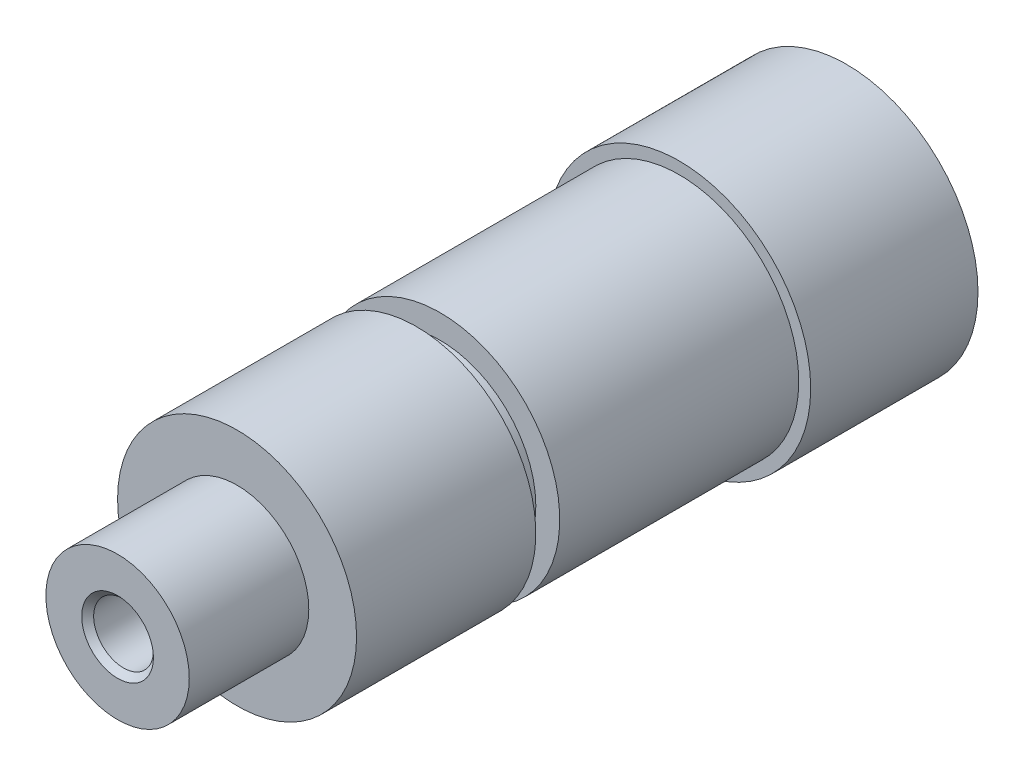
ISO-10303-21;
HEADER;
FILE_DESCRIPTION(('STEP AP214'),'2;1');
FILE_NAME('part.step','',(''),(''),'','','');
FILE_SCHEMA(('AUTOMOTIVE_DESIGN { 1 0 10303 214 1 1 1 1 }'));
ENDSEC;
DATA;
#1=APPLICATION_CONTEXT('core data for automotive mechanical design processes');
#2=APPLICATION_PROTOCOL_DEFINITION('international standard','automotive_design',2000,#1);
#3=PRODUCT_CONTEXT('',#1,'mechanical');
#4=PRODUCT('Part','Part','',(#3));
#5=PRODUCT_RELATED_PRODUCT_CATEGORY('part','',(#4));
#6=PRODUCT_DEFINITION_FORMATION('','',#4);
#7=PRODUCT_DEFINITION_CONTEXT('part definition',#1,'design');
#8=PRODUCT_DEFINITION('design','',#6,#7);
#9=PRODUCT_DEFINITION_SHAPE('','',#8);
#10=(LENGTH_UNIT() NAMED_UNIT(*) SI_UNIT(.MILLI.,.METRE.));
#11=(NAMED_UNIT(*) PLANE_ANGLE_UNIT() SI_UNIT($,.RADIAN.));
#12=(NAMED_UNIT(*) SI_UNIT($,.STERADIAN.) SOLID_ANGLE_UNIT());
#13=UNCERTAINTY_MEASURE_WITH_UNIT(LENGTH_MEASURE(1.E-05),#10,'distance_accuracy_value','');
#14=(GEOMETRIC_REPRESENTATION_CONTEXT(3) GLOBAL_UNCERTAINTY_ASSIGNED_CONTEXT((#13)) GLOBAL_UNIT_ASSIGNED_CONTEXT((#10,
#11,#12)) REPRESENTATION_CONTEXT('',''));
#15=CARTESIAN_POINT('',(0.,0.,0.));
#16=DIRECTION('',(0.,0.,1.));
#17=DIRECTION('',(1.,0.,0.));
#18=AXIS2_PLACEMENT_3D('',#15,#16,#17);
#19=CARTESIAN_POINT('',(0.,0.,51.));
#20=DIRECTION('',(0.,0.,1.));
#21=DIRECTION('',(1.,0.,0.));
#22=AXIS2_PLACEMENT_3D('',#19,#20,#21);
#23=PLANE('',#22);
#24=CARTESIAN_POINT('',(0.,0.,51.));
#25=DIRECTION('',(0.,0.,1.));
#26=DIRECTION('',(1.,0.,0.));
#27=AXIS2_PLACEMENT_3D('',#24,#25,#26);
#28=CIRCLE('',#27,10.);
#29=CARTESIAN_POINT('',(10.,0.,51.));
#30=VERTEX_POINT('',#29);
#31=EDGE_CURVE('E88',#30,#30,#28,.T.);
#32=ORIENTED_EDGE('',*,*,#31,.T.);
#33=EDGE_LOOP('',(#32));
#34=FACE_BOUND('',#33,.T.);
#35=CARTESIAN_POINT('',(0.,0.,51.));
#36=DIRECTION('',(0.,0.,1.));
#37=DIRECTION('',(1.,0.,0.));
#38=AXIS2_PLACEMENT_3D('',#35,#36,#37);
#39=CIRCLE('',#38,6.);
#40=CARTESIAN_POINT('',(6.,0.,51.));
#41=VERTEX_POINT('',#40);
#42=EDGE_CURVE('E67',#41,#41,#39,.T.);
#43=ORIENTED_EDGE('',*,*,#42,.F.);
#44=EDGE_LOOP('',(#43));
#45=FACE_BOUND('',#44,.T.);
#46=ADVANCED_FACE('F40',(#34,#45),#23,.T.);
#47=CARTESIAN_POINT('',(0.,0.,51.));
#48=DIRECTION('',(0.,0.,-1.));
#49=DIRECTION('',(-1.,0.,0.));
#50=AXIS2_PLACEMENT_3D('',#47,#48,#49);
#51=CYLINDRICAL_SURFACE('',#50,10.);
#52=CARTESIAN_POINT('',(0.,0.,14.));
#53=DIRECTION('',(0.,0.,1.));
#54=DIRECTION('',(1.,0.,0.));
#55=AXIS2_PLACEMENT_3D('',#52,#53,#54);
#56=CIRCLE('',#55,10.);
#57=CARTESIAN_POINT('',(10.,0.,14.));
#58=VERTEX_POINT('',#57);
#59=EDGE_CURVE('E85',#58,#58,#56,.T.);
#60=ORIENTED_EDGE('',*,*,#59,.T.);
#61=EDGE_LOOP('',(#60));
#62=FACE_BOUND('',#61,.T.);
#63=CARTESIAN_POINT('',(0.,0.,34.));
#64=DIRECTION('',(0.,0.,-1.));
#65=DIRECTION('',(-1.,0.,0.));
#66=AXIS2_PLACEMENT_3D('',#63,#64,#65);
#67=CIRCLE('',#66,10.);
#68=CARTESIAN_POINT('',(-10.,0.,34.));
#69=VERTEX_POINT('',#68);
#70=EDGE_CURVE('E82',#69,#69,#67,.T.);
#71=ORIENTED_EDGE('',*,*,#70,.T.);
#72=EDGE_LOOP('',(#71));
#73=FACE_BOUND('',#72,.T.);
#74=ADVANCED_FACE('F110',(#62,#73),#51,.T.);
#75=CARTESIAN_POINT('',(0.,0.,14.));
#76=DIRECTION('',(0.,0.,1.));
#77=DIRECTION('',(1.,0.,0.));
#78=AXIS2_PLACEMENT_3D('',#75,#76,#77);
#79=PLANE('',#78);
#80=CARTESIAN_POINT('',(0.,0.,14.));
#81=DIRECTION('',(0.,0.,1.));
#82=DIRECTION('',(1.,0.,0.));
#83=AXIS2_PLACEMENT_3D('',#80,#81,#82);
#84=CIRCLE('',#83,11.);
#85=CARTESIAN_POINT('',(11.,0.,14.));
#86=VERTEX_POINT('',#85);
#87=EDGE_CURVE('E11',#86,#86,#84,.T.);
#88=ORIENTED_EDGE('',*,*,#87,.T.);
#89=EDGE_LOOP('',(#88));
#90=FACE_BOUND('',#89,.T.);
#91=ORIENTED_EDGE('',*,*,#59,.F.);
#92=EDGE_LOOP('',(#91));
#93=FACE_BOUND('',#92,.T.);
#94=ADVANCED_FACE('F106',(#90,#93),#79,.T.);
#95=CARTESIAN_POINT('',(0.,0.,14.));
#96=DIRECTION('',(0.,0.,-1.));
#97=DIRECTION('',(-1.,0.,0.));
#98=AXIS2_PLACEMENT_3D('',#95,#96,#97);
#99=CYLINDRICAL_SURFACE('',#98,11.);
#100=ORIENTED_EDGE('',*,*,#87,.F.);
#101=EDGE_LOOP('',(#100));
#102=FACE_BOUND('',#101,.T.);
#103=CARTESIAN_POINT('',(0.,0.,0.));
#104=DIRECTION('',(0.,0.,1.));
#105=DIRECTION('',(1.,0.,0.));
#106=AXIS2_PLACEMENT_3D('',#103,#104,#105);
#107=CIRCLE('',#106,11.);
#108=CARTESIAN_POINT('',(11.,0.,0.));
#109=VERTEX_POINT('',#108);
#110=EDGE_CURVE('E47',#109,#109,#107,.T.);
#111=ORIENTED_EDGE('',*,*,#110,.T.);
#112=EDGE_LOOP('',(#111));
#113=FACE_BOUND('',#112,.T.);
#114=ADVANCED_FACE('F42',(#102,#113),#99,.T.);
#115=CARTESIAN_POINT('',(0.,0.,0.));
#116=DIRECTION('',(0.,0.,1.));
#117=DIRECTION('',(1.,0.,0.));
#118=AXIS2_PLACEMENT_3D('',#115,#116,#117);
#119=PLANE('',#118);
#120=ORIENTED_EDGE('',*,*,#110,.F.);
#121=EDGE_LOOP('',(#120));
#122=FACE_BOUND('',#121,.T.);
#123=ADVANCED_FACE('F95',(#122),#119,.F.);
#124=CARTESIAN_POINT('',(10.,0.,34.));
#125=DIRECTION('',(0.,0.,1.));
#126=DIRECTION('',(1.,0.,0.));
#127=AXIS2_PLACEMENT_3D('',#124,#125,#126);
#128=PLANE('',#127);
#129=CARTESIAN_POINT('',(0.,0.,34.));
#130=DIRECTION('',(0.,0.,-1.));
#131=DIRECTION('',(-1.,0.,0.));
#132=AXIS2_PLACEMENT_3D('',#129,#130,#131);
#133=CIRCLE('',#132,8.);
#134=CARTESIAN_POINT('',(-8.,0.,34.));
#135=VERTEX_POINT('',#134);
#136=EDGE_CURVE('E79',#135,#135,#133,.T.);
#137=ORIENTED_EDGE('',*,*,#136,.T.);
#138=EDGE_LOOP('',(#137));
#139=FACE_BOUND('',#138,.T.);
#140=ORIENTED_EDGE('',*,*,#70,.F.);
#141=EDGE_LOOP('',(#140));
#142=FACE_BOUND('',#141,.T.);
#143=ADVANCED_FACE('F97',(#139,#142),#128,.T.);
#144=CARTESIAN_POINT('',(0.,0.,0.));
#145=DIRECTION('',(0.,0.,-1.));
#146=DIRECTION('',(-1.,0.,0.));
#147=AXIS2_PLACEMENT_3D('',#144,#145,#146);
#148=CYLINDRICAL_SURFACE('',#147,8.);
#149=CARTESIAN_POINT('',(0.,0.,36.));
#150=DIRECTION('',(0.,0.,-1.));
#151=DIRECTION('',(-1.,0.,0.));
#152=AXIS2_PLACEMENT_3D('',#149,#150,#151);
#153=CIRCLE('',#152,8.);
#154=CARTESIAN_POINT('',(-8.,0.,36.));
#155=VERTEX_POINT('',#154);
#156=EDGE_CURVE('E76',#155,#155,#153,.T.);
#157=ORIENTED_EDGE('',*,*,#156,.T.);
#158=EDGE_LOOP('',(#157));
#159=FACE_BOUND('',#158,.T.);
#160=ORIENTED_EDGE('',*,*,#136,.F.);
#161=EDGE_LOOP('',(#160));
#162=FACE_BOUND('',#161,.T.);
#163=ADVANCED_FACE('F103',(#159,#162),#148,.T.);
#164=CARTESIAN_POINT('',(8.,0.,36.));
#165=DIRECTION('',(0.,0.,-1.));
#166=DIRECTION('',(-1.,0.,0.));
#167=AXIS2_PLACEMENT_3D('',#164,#165,#166);
#168=PLANE('',#167);
#169=CARTESIAN_POINT('',(0.,0.,36.));
#170=DIRECTION('',(0.,0.,-1.));
#171=DIRECTION('',(-1.,0.,0.));
#172=AXIS2_PLACEMENT_3D('',#169,#170,#171);
#173=CIRCLE('',#172,10.);
#174=CARTESIAN_POINT('',(-10.,0.,36.));
#175=VERTEX_POINT('',#174);
#176=EDGE_CURVE('E73',#175,#175,#173,.T.);
#177=ORIENTED_EDGE('',*,*,#176,.T.);
#178=EDGE_LOOP('',(#177));
#179=FACE_BOUND('',#178,.T.);
#180=ORIENTED_EDGE('',*,*,#156,.F.);
#181=EDGE_LOOP('',(#180));
#182=FACE_BOUND('',#181,.T.);
#183=ADVANCED_FACE('F122',(#179,#182),#168,.T.);
#184=ORIENTED_EDGE('',*,*,#31,.F.);
#185=EDGE_LOOP('',(#184));
#186=FACE_BOUND('',#185,.T.);
#187=ORIENTED_EDGE('',*,*,#176,.F.);
#188=EDGE_LOOP('',(#187));
#189=FACE_BOUND('',#188,.T.);
#190=ADVANCED_FACE('F117',(#186,#189),#51,.T.);
#191=CARTESIAN_POINT('',(0.,0.,61.));
#192=DIRECTION('',(0.,0.,-1.));
#193=DIRECTION('',(-1.,0.,0.));
#194=AXIS2_PLACEMENT_3D('',#191,#192,#193);
#195=CYLINDRICAL_SURFACE('',#194,6.);
#196=CARTESIAN_POINT('',(0.,0.,61.));
#197=DIRECTION('',(0.,0.,1.));
#198=DIRECTION('',(1.,0.,0.));
#199=AXIS2_PLACEMENT_3D('',#196,#197,#198);
#200=CIRCLE('',#199,6.);
#201=CARTESIAN_POINT('',(6.,0.,61.));
#202=VERTEX_POINT('',#201);
#203=EDGE_CURVE('E70',#202,#202,#200,.T.);
#204=ORIENTED_EDGE('',*,*,#203,.F.);
#205=EDGE_LOOP('',(#204));
#206=FACE_BOUND('',#205,.T.);
#207=ORIENTED_EDGE('',*,*,#42,.T.);
#208=EDGE_LOOP('',(#207));
#209=FACE_BOUND('',#208,.T.);
#210=ADVANCED_FACE('F127',(#206,#209),#195,.T.);
#211=CARTESIAN_POINT('',(0.,0.,61.));
#212=DIRECTION('',(0.,0.,1.));
#213=DIRECTION('',(1.,0.,0.));
#214=AXIS2_PLACEMENT_3D('',#211,#212,#213);
#215=PLANE('',#214);
#216=CARTESIAN_POINT('',(0.,0.,61.));
#217=DIRECTION('',(0.,0.,1.));
#218=DIRECTION('',(1.,0.,0.));
#219=AXIS2_PLACEMENT_3D('',#216,#217,#218);
#220=CIRCLE('',#219,3.);
#221=CARTESIAN_POINT('',(3.,0.,61.));
#222=VERTEX_POINT('',#221);
#223=EDGE_CURVE('E62',#222,#222,#220,.T.);
#224=ORIENTED_EDGE('',*,*,#223,.F.);
#225=EDGE_LOOP('',(#224));
#226=FACE_BOUND('',#225,.T.);
#227=ORIENTED_EDGE('',*,*,#203,.T.);
#228=EDGE_LOOP('',(#227));
#229=FACE_BOUND('',#228,.T.);
#230=ADVANCED_FACE('F130',(#226,#229),#215,.T.);
#231=CARTESIAN_POINT('',(0.,0.,61.));
#232=DIRECTION('',(0.,0.,1.));
#233=DIRECTION('',(1.,0.,0.));
#234=AXIS2_PLACEMENT_3D('',#231,#232,#233);
#235=CONICAL_SURFACE('',#234,3.,0.785398163397451);
#236=CARTESIAN_POINT('',(0.,0.,60.5));
#237=DIRECTION('',(0.,0.,1.));
#238=DIRECTION('',(1.,0.,0.));
#239=AXIS2_PLACEMENT_3D('',#236,#237,#238);
#240=CIRCLE('',#239,2.5);
#241=CARTESIAN_POINT('',(2.5,0.,60.5));
#242=VERTEX_POINT('',#241);
#243=EDGE_CURVE('E59',#242,#242,#240,.T.);
#244=ORIENTED_EDGE('',*,*,#243,.F.);
#245=EDGE_LOOP('',(#244));
#246=FACE_BOUND('',#245,.T.);
#247=ORIENTED_EDGE('',*,*,#223,.T.);
#248=EDGE_LOOP('',(#247));
#249=FACE_BOUND('',#248,.T.);
#250=ADVANCED_FACE('F134',(#246,#249),#235,.F.);
#251=CARTESIAN_POINT('',(0.,0.,61.));
#252=DIRECTION('',(0.,0.,1.));
#253=DIRECTION('',(1.,0.,0.));
#254=AXIS2_PLACEMENT_3D('',#251,#252,#253);
#255=CYLINDRICAL_SURFACE('',#254,2.5);
#256=CARTESIAN_POINT('',(0.,0.,42.));
#257=DIRECTION('',(0.,0.,1.));
#258=DIRECTION('',(1.,0.,0.));
#259=AXIS2_PLACEMENT_3D('',#256,#257,#258);
#260=CIRCLE('',#259,2.5);
#261=CARTESIAN_POINT('',(2.5,0.,42.));
#262=VERTEX_POINT('',#261);
#263=EDGE_CURVE('E57',#262,#262,#260,.T.);
#264=ORIENTED_EDGE('',*,*,#263,.F.);
#265=EDGE_LOOP('',(#264));
#266=FACE_BOUND('',#265,.T.);
#267=ORIENTED_EDGE('',*,*,#243,.T.);
#268=EDGE_LOOP('',(#267));
#269=FACE_BOUND('',#268,.T.);
#270=ADVANCED_FACE('F53',(#266,#269),#255,.F.);
#271=CARTESIAN_POINT('',(0.,0.,42.));
#272=DIRECTION('',(0.,0.,1.));
#273=DIRECTION('',(1.,0.,0.));
#274=AXIS2_PLACEMENT_3D('',#271,#272,#273);
#275=CONICAL_SURFACE('',#274,2.5,1.02974425867665);
#276=CARTESIAN_POINT('',(0.,0.,40.4978484524311));
#277=VERTEX_POINT('',#276);
#278=VERTEX_LOOP('',#277);
#279=FACE_BOUND('',#278,.T.);
#280=ORIENTED_EDGE('',*,*,#263,.T.);
#281=EDGE_LOOP('',(#280));
#282=FACE_BOUND('',#281,.T.);
#283=ADVANCED_FACE('F50',(#279,#282),#275,.F.);
#284=CLOSED_SHELL('',(#46,#74,#94,#114,#123,#143,#163,#183,#190,#210,#230,#250,#270,#283));
#285=MANIFOLD_SOLID_BREP('B2',#284);
#286=ADVANCED_BREP_SHAPE_REPRESENTATION('',(#18,#285),#14);
#287=SHAPE_DEFINITION_REPRESENTATION(#9,#286);
ENDSEC;
END-ISO-10303-21;
